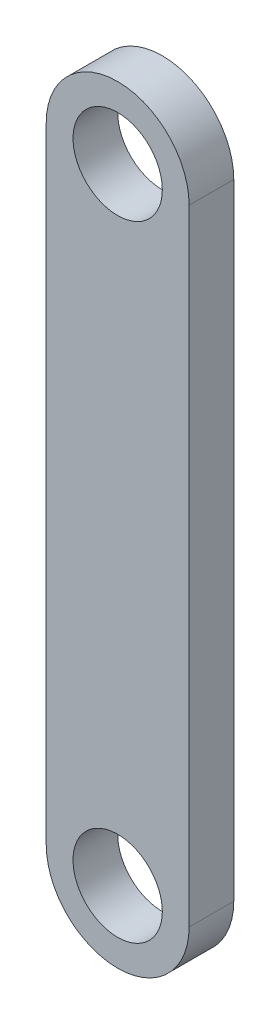
ISO-10303-21;
HEADER;
FILE_DESCRIPTION(('STEP AP214'),'2;1');
FILE_NAME('part.step','',(''),(''),'','','');
FILE_SCHEMA(('AUTOMOTIVE_DESIGN { 1 0 10303 214 1 1 1 1 }'));
ENDSEC;
DATA;
#1=APPLICATION_CONTEXT('core data for automotive mechanical design processes');
#2=APPLICATION_PROTOCOL_DEFINITION('international standard','automotive_design',2000,#1);
#3=PRODUCT_CONTEXT('',#1,'mechanical');
#4=PRODUCT('Part','Part','',(#3));
#5=PRODUCT_RELATED_PRODUCT_CATEGORY('part','',(#4));
#6=PRODUCT_DEFINITION_FORMATION('','',#4);
#7=PRODUCT_DEFINITION_CONTEXT('part definition',#1,'design');
#8=PRODUCT_DEFINITION('design','',#6,#7);
#9=PRODUCT_DEFINITION_SHAPE('','',#8);
#10=(LENGTH_UNIT() NAMED_UNIT(*) SI_UNIT(.MILLI.,.METRE.));
#11=(NAMED_UNIT(*) PLANE_ANGLE_UNIT() SI_UNIT($,.RADIAN.));
#12=(NAMED_UNIT(*) SI_UNIT($,.STERADIAN.) SOLID_ANGLE_UNIT());
#13=UNCERTAINTY_MEASURE_WITH_UNIT(LENGTH_MEASURE(1.E-05),#10,'distance_accuracy_value','');
#14=(GEOMETRIC_REPRESENTATION_CONTEXT(3) GLOBAL_UNCERTAINTY_ASSIGNED_CONTEXT((#13)) GLOBAL_UNIT_ASSIGNED_CONTEXT((#10,
#11,#12)) REPRESENTATION_CONTEXT('',''));
#15=CARTESIAN_POINT('',(0.,0.,0.));
#16=DIRECTION('',(0.,0.,1.));
#17=DIRECTION('',(1.,0.,0.));
#18=AXIS2_PLACEMENT_3D('',#15,#16,#17);
#19=CARTESIAN_POINT('',(0.,-3.5,0.5));
#20=DIRECTION('',(0.,0.,1.));
#21=DIRECTION('',(1.,0.,0.));
#22=AXIS2_PLACEMENT_3D('',#19,#20,#21);
#23=PLANE('',#22);
#24=CARTESIAN_POINT('',(0.,3.5,0.5));
#25=DIRECTION('',(0.,0.,1.));
#26=DIRECTION('',(1.,0.,0.));
#27=AXIS2_PLACEMENT_3D('',#24,#25,#26);
#28=CIRCLE('',#27,0.5);
#29=CARTESIAN_POINT('',(0.499999999999999,3.5,0.5));
#30=VERTEX_POINT('',#29);
#31=EDGE_CURVE('E100',#30,#30,#28,.T.);
#32=ORIENTED_EDGE('',*,*,#31,.F.);
#33=EDGE_LOOP('',(#32));
#34=FACE_BOUND('',#33,.T.);
#35=CARTESIAN_POINT('',(0.,-3.5,0.5));
#36=DIRECTION('',(0.,0.,1.));
#37=DIRECTION('',(1.,0.,0.));
#38=AXIS2_PLACEMENT_3D('',#35,#36,#37);
#39=CIRCLE('',#38,0.800000000000001);
#40=CARTESIAN_POINT('',(-0.800000000000001,-3.5,0.5));
#41=VERTEX_POINT('',#40);
#42=CARTESIAN_POINT('',(0.800000000000001,-3.5,0.5));
#43=VERTEX_POINT('',#42);
#44=EDGE_CURVE('E85',#41,#43,#39,.T.);
#45=ORIENTED_EDGE('',*,*,#44,.T.);
#46=DIRECTION('',(0.,1.,0.));
#47=VECTOR('',#46,1.);
#48=CARTESIAN_POINT('',(0.800000000000001,-3.5,0.5));
#49=LINE('',#48,#47);
#50=CARTESIAN_POINT('',(0.8,3.5,0.5));
#51=VERTEX_POINT('',#50);
#52=EDGE_CURVE('E80',#43,#51,#49,.T.);
#53=ORIENTED_EDGE('',*,*,#52,.T.);
#54=CARTESIAN_POINT('',(0.,3.5,0.5));
#55=DIRECTION('',(0.,0.,1.));
#56=DIRECTION('',(1.,0.,0.));
#57=AXIS2_PLACEMENT_3D('',#54,#55,#56);
#58=CIRCLE('',#57,0.800000000000001);
#59=CARTESIAN_POINT('',(-0.800000000000002,3.5,0.5));
#60=VERTEX_POINT('',#59);
#61=EDGE_CURVE('E83',#51,#60,#58,.T.);
#62=ORIENTED_EDGE('',*,*,#61,.T.);
#63=DIRECTION('',(0.,-1.,0.));
#64=VECTOR('',#63,1.);
#65=CARTESIAN_POINT('',(-0.800000000000001,-3.5,0.5));
#66=LINE('',#65,#64);
#67=EDGE_CURVE('E50',#60,#41,#66,.T.);
#68=ORIENTED_EDGE('',*,*,#67,.T.);
#69=EDGE_LOOP('',(#45,#53,#62,#68));
#70=FACE_BOUND('',#69,.T.);
#71=CARTESIAN_POINT('',(0.,-3.5,0.5));
#72=DIRECTION('',(0.,0.,1.));
#73=DIRECTION('',(1.,0.,0.));
#74=AXIS2_PLACEMENT_3D('',#71,#72,#73);
#75=CIRCLE('',#74,0.5);
#76=CARTESIAN_POINT('',(0.5,-3.5,0.5));
#77=VERTEX_POINT('',#76);
#78=EDGE_CURVE('E115',#77,#77,#75,.T.);
#79=ORIENTED_EDGE('',*,*,#78,.F.);
#80=EDGE_LOOP('',(#79));
#81=FACE_BOUND('',#80,.T.);
#82=ADVANCED_FACE('F33',(#34,#70,#81),#23,.T.);
#83=CARTESIAN_POINT('',(0.,-3.5,0.));
#84=DIRECTION('',(0.,0.,1.));
#85=DIRECTION('',(1.,0.,0.));
#86=AXIS2_PLACEMENT_3D('',#83,#84,#85);
#87=PLANE('',#86);
#88=CARTESIAN_POINT('',(0.,-3.5,0.));
#89=DIRECTION('',(0.,0.,1.));
#90=DIRECTION('',(1.,0.,0.));
#91=AXIS2_PLACEMENT_3D('',#88,#89,#90);
#92=CIRCLE('',#91,0.800000000000001);
#93=CARTESIAN_POINT('',(-0.800000000000001,-3.5,0.));
#94=VERTEX_POINT('',#93);
#95=CARTESIAN_POINT('',(0.800000000000001,-3.5,0.));
#96=VERTEX_POINT('',#95);
#97=EDGE_CURVE('E97',#94,#96,#92,.T.);
#98=ORIENTED_EDGE('',*,*,#97,.F.);
#99=DIRECTION('',(0.,-1.,0.));
#100=VECTOR('',#99,1.);
#101=CARTESIAN_POINT('',(-0.800000000000001,-3.5,0.));
#102=LINE('',#101,#100);
#103=CARTESIAN_POINT('',(-0.800000000000002,3.5,0.));
#104=VERTEX_POINT('',#103);
#105=EDGE_CURVE('E73',#104,#94,#102,.T.);
#106=ORIENTED_EDGE('',*,*,#105,.F.);
#107=CARTESIAN_POINT('',(0.,3.5,0.));
#108=DIRECTION('',(0.,0.,1.));
#109=DIRECTION('',(1.,0.,0.));
#110=AXIS2_PLACEMENT_3D('',#107,#108,#109);
#111=CIRCLE('',#110,0.800000000000001);
#112=CARTESIAN_POINT('',(0.8,3.5,0.));
#113=VERTEX_POINT('',#112);
#114=EDGE_CURVE('E67',#113,#104,#111,.T.);
#115=ORIENTED_EDGE('',*,*,#114,.F.);
#116=DIRECTION('',(0.,1.,0.));
#117=VECTOR('',#116,1.);
#118=CARTESIAN_POINT('',(0.800000000000001,-3.5,0.));
#119=LINE('',#118,#117);
#120=EDGE_CURVE('E89',#96,#113,#119,.T.);
#121=ORIENTED_EDGE('',*,*,#120,.F.);
#122=EDGE_LOOP('',(#98,#106,#115,#121));
#123=FACE_BOUND('',#122,.T.);
#124=CARTESIAN_POINT('',(0.,3.5,0.));
#125=DIRECTION('',(0.,0.,1.));
#126=DIRECTION('',(1.,0.,0.));
#127=AXIS2_PLACEMENT_3D('',#124,#125,#126);
#128=CIRCLE('',#127,0.5);
#129=CARTESIAN_POINT('',(0.499999999999999,3.5,0.));
#130=VERTEX_POINT('',#129);
#131=EDGE_CURVE('E112',#130,#130,#128,.T.);
#132=ORIENTED_EDGE('',*,*,#131,.T.);
#133=EDGE_LOOP('',(#132));
#134=FACE_BOUND('',#133,.T.);
#135=CARTESIAN_POINT('',(0.,-3.5,0.));
#136=DIRECTION('',(0.,0.,1.));
#137=DIRECTION('',(1.,0.,0.));
#138=AXIS2_PLACEMENT_3D('',#135,#136,#137);
#139=CIRCLE('',#138,0.5);
#140=CARTESIAN_POINT('',(0.5,-3.5,0.));
#141=VERTEX_POINT('',#140);
#142=EDGE_CURVE('E118',#141,#141,#139,.T.);
#143=ORIENTED_EDGE('',*,*,#142,.T.);
#144=EDGE_LOOP('',(#143));
#145=FACE_BOUND('',#144,.T.);
#146=ADVANCED_FACE('F108',(#123,#134,#145),#87,.F.);
#147=CARTESIAN_POINT('',(0.,-3.5,0.5));
#148=DIRECTION('',(0.,0.,-1.));
#149=DIRECTION('',(-1.,0.,0.));
#150=AXIS2_PLACEMENT_3D('',#147,#148,#149);
#151=CYLINDRICAL_SURFACE('',#150,0.800000000000001);
#152=ORIENTED_EDGE('',*,*,#97,.T.);
#153=DIRECTION('',(0.,0.,-1.));
#154=VECTOR('',#153,1.);
#155=CARTESIAN_POINT('',(0.800000000000001,-3.5,0.5));
#156=LINE('',#155,#154);
#157=EDGE_CURVE('E11',#43,#96,#156,.T.);
#158=ORIENTED_EDGE('',*,*,#157,.F.);
#159=ORIENTED_EDGE('',*,*,#44,.F.);
#160=DIRECTION('',(0.,0.,-1.));
#161=VECTOR('',#160,1.);
#162=CARTESIAN_POINT('',(-0.800000000000001,-3.5,0.5));
#163=LINE('',#162,#161);
#164=EDGE_CURVE('E93',#41,#94,#163,.T.);
#165=ORIENTED_EDGE('',*,*,#164,.T.);
#166=EDGE_LOOP('',(#152,#158,#159,#165));
#167=FACE_BOUND('',#166,.T.);
#168=ADVANCED_FACE('F35',(#167),#151,.T.);
#169=CARTESIAN_POINT('',(0.800000000000001,-3.5,0.5));
#170=DIRECTION('',(-1.,0.,0.));
#171=DIRECTION('',(0.,-1.,0.));
#172=AXIS2_PLACEMENT_3D('',#169,#170,#171);
#173=PLANE('',#172);
#174=ORIENTED_EDGE('',*,*,#120,.T.);
#175=DIRECTION('',(0.,0.,-1.));
#176=VECTOR('',#175,1.);
#177=CARTESIAN_POINT('',(0.8,3.5,0.5));
#178=LINE('',#177,#176);
#179=EDGE_CURVE('E42',#51,#113,#178,.T.);
#180=ORIENTED_EDGE('',*,*,#179,.F.);
#181=ORIENTED_EDGE('',*,*,#52,.F.);
#182=ORIENTED_EDGE('',*,*,#157,.T.);
#183=EDGE_LOOP('',(#174,#180,#181,#182));
#184=FACE_BOUND('',#183,.T.);
#185=ADVANCED_FACE('F88',(#184),#173,.F.);
#186=CARTESIAN_POINT('',(0.,3.5,0.5));
#187=DIRECTION('',(0.,0.,-1.));
#188=DIRECTION('',(-1.,0.,0.));
#189=AXIS2_PLACEMENT_3D('',#186,#187,#188);
#190=CYLINDRICAL_SURFACE('',#189,0.800000000000001);
#191=ORIENTED_EDGE('',*,*,#114,.T.);
#192=DIRECTION('',(0.,0.,-1.));
#193=VECTOR('',#192,1.);
#194=CARTESIAN_POINT('',(-0.800000000000002,3.5,0.5));
#195=LINE('',#194,#193);
#196=EDGE_CURVE('E90',#60,#104,#195,.T.);
#197=ORIENTED_EDGE('',*,*,#196,.F.);
#198=ORIENTED_EDGE('',*,*,#61,.F.);
#199=ORIENTED_EDGE('',*,*,#179,.T.);
#200=EDGE_LOOP('',(#191,#197,#198,#199));
#201=FACE_BOUND('',#200,.T.);
#202=ADVANCED_FACE('F91',(#201),#190,.T.);
#203=CARTESIAN_POINT('',(-0.800000000000001,-3.5,0.5));
#204=DIRECTION('',(1.,0.,0.));
#205=DIRECTION('',(0.,1.,0.));
#206=AXIS2_PLACEMENT_3D('',#203,#204,#205);
#207=PLANE('',#206);
#208=ORIENTED_EDGE('',*,*,#105,.T.);
#209=ORIENTED_EDGE('',*,*,#164,.F.);
#210=ORIENTED_EDGE('',*,*,#67,.F.);
#211=ORIENTED_EDGE('',*,*,#196,.T.);
#212=EDGE_LOOP('',(#208,#209,#210,#211));
#213=FACE_BOUND('',#212,.T.);
#214=ADVANCED_FACE('F105',(#213),#207,.F.);
#215=CARTESIAN_POINT('',(0.,3.5,0.5));
#216=DIRECTION('',(0.,0.,-1.));
#217=DIRECTION('',(-1.,0.,0.));
#218=AXIS2_PLACEMENT_3D('',#215,#216,#217);
#219=CYLINDRICAL_SURFACE('',#218,0.5);
#220=ORIENTED_EDGE('',*,*,#31,.T.);
#221=EDGE_LOOP('',(#220));
#222=FACE_BOUND('',#221,.T.);
#223=ORIENTED_EDGE('',*,*,#131,.F.);
#224=EDGE_LOOP('',(#223));
#225=FACE_BOUND('',#224,.T.);
#226=ADVANCED_FACE('F135',(#222,#225),#219,.F.);
#227=CARTESIAN_POINT('',(0.,-3.5,0.5));
#228=DIRECTION('',(0.,0.,-1.));
#229=DIRECTION('',(-1.,0.,0.));
#230=AXIS2_PLACEMENT_3D('',#227,#228,#229);
#231=CYLINDRICAL_SURFACE('',#230,0.5);
#232=ORIENTED_EDGE('',*,*,#78,.T.);
#233=EDGE_LOOP('',(#232));
#234=FACE_BOUND('',#233,.T.);
#235=ORIENTED_EDGE('',*,*,#142,.F.);
#236=EDGE_LOOP('',(#235));
#237=FACE_BOUND('',#236,.T.);
#238=ADVANCED_FACE('F124',(#234,#237),#231,.F.);
#239=CLOSED_SHELL('',(#82,#146,#168,#185,#202,#214,#226,#238));
#240=MANIFOLD_SOLID_BREP('B2',#239);
#241=ADVANCED_BREP_SHAPE_REPRESENTATION('',(#18,#240),#14);
#242=SHAPE_DEFINITION_REPRESENTATION(#9,#241);
ENDSEC;
END-ISO-10303-21;
